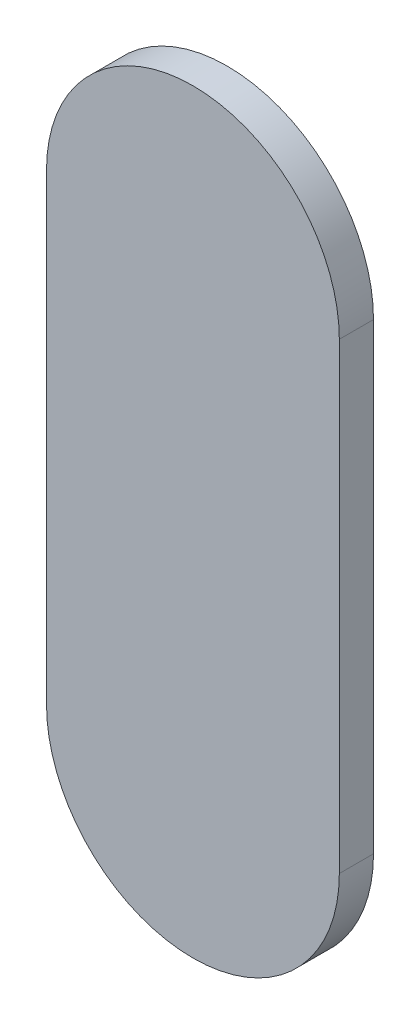
ISO-10303-21;
HEADER;
FILE_DESCRIPTION(('STEP AP214'),'2;1');
FILE_NAME('part.step','',(''),(''),'','','');
FILE_SCHEMA(('AUTOMOTIVE_DESIGN { 1 0 10303 214 1 1 1 1 }'));
ENDSEC;
DATA;
#1=APPLICATION_CONTEXT('core data for automotive mechanical design processes');
#2=APPLICATION_PROTOCOL_DEFINITION('international standard','automotive_design',2000,#1);
#3=PRODUCT_CONTEXT('',#1,'mechanical');
#4=PRODUCT('Part','Part','',(#3));
#5=PRODUCT_RELATED_PRODUCT_CATEGORY('part','',(#4));
#6=PRODUCT_DEFINITION_FORMATION('','',#4);
#7=PRODUCT_DEFINITION_CONTEXT('part definition',#1,'design');
#8=PRODUCT_DEFINITION('design','',#6,#7);
#9=PRODUCT_DEFINITION_SHAPE('','',#8);
#10=(LENGTH_UNIT() NAMED_UNIT(*) SI_UNIT(.MILLI.,.METRE.));
#11=(NAMED_UNIT(*) PLANE_ANGLE_UNIT() SI_UNIT($,.RADIAN.));
#12=(NAMED_UNIT(*) SI_UNIT($,.STERADIAN.) SOLID_ANGLE_UNIT());
#13=UNCERTAINTY_MEASURE_WITH_UNIT(LENGTH_MEASURE(1.E-05),#10,'distance_accuracy_value','');
#14=(GEOMETRIC_REPRESENTATION_CONTEXT(3) GLOBAL_UNCERTAINTY_ASSIGNED_CONTEXT((#13)) GLOBAL_UNIT_ASSIGNED_CONTEXT((#10,
#11,#12)) REPRESENTATION_CONTEXT('',''));
#15=CARTESIAN_POINT('',(0.,0.,0.));
#16=DIRECTION('',(0.,0.,1.));
#17=DIRECTION('',(1.,0.,0.));
#18=AXIS2_PLACEMENT_3D('',#15,#16,#17);
#19=CARTESIAN_POINT('',(135.05,-118.236,1.635));
#20=DIRECTION('',(0.,0.,1.));
#21=DIRECTION('',(1.,0.,0.));
#22=AXIS2_PLACEMENT_3D('',#19,#20,#21);
#23=PLANE('',#22);
#24=DIRECTION('',(0.,-1.,0.));
#25=VECTOR('',#24,1.);
#26=CARTESIAN_POINT('',(135.05,-118.236,1.635));
#27=LINE('',#26,#25);
#28=CARTESIAN_POINT('',(135.05,-118.236,1.635));
#29=VERTEX_POINT('',#28);
#30=CARTESIAN_POINT('',(135.05,-118.71,1.635));
#31=VERTEX_POINT('',#30);
#32=EDGE_CURVE('E83',#29,#31,#27,.T.);
#33=ORIENTED_EDGE('',*,*,#32,.T.);
#34=CARTESIAN_POINT('',(135.2,-118.71,1.635));
#35=DIRECTION('',(0.,0.,1.));
#36=DIRECTION('',(-1.,0.,0.));
#37=AXIS2_PLACEMENT_3D('',#34,#35,#36);
#38=CIRCLE('',#37,0.15);
#39=CARTESIAN_POINT('',(135.35,-118.71,1.635));
#40=VERTEX_POINT('',#39);
#41=EDGE_CURVE('E109',#31,#40,#38,.T.);
#42=ORIENTED_EDGE('',*,*,#41,.T.);
#43=DIRECTION('',(0.,1.,0.));
#44=VECTOR('',#43,1.);
#45=CARTESIAN_POINT('',(135.35,-118.71,1.635));
#46=LINE('',#45,#44);
#47=CARTESIAN_POINT('',(135.35,-118.236,1.635));
#48=VERTEX_POINT('',#47);
#49=EDGE_CURVE('E20',#40,#48,#46,.T.);
#50=ORIENTED_EDGE('',*,*,#49,.T.);
#51=CARTESIAN_POINT('',(135.2,-118.236,1.635));
#52=DIRECTION('',(0.,0.,1.));
#53=DIRECTION('',(1.,0.,0.));
#54=AXIS2_PLACEMENT_3D('',#51,#52,#53);
#55=CIRCLE('',#54,0.15);
#56=EDGE_CURVE('E11',#48,#29,#55,.T.);
#57=ORIENTED_EDGE('',*,*,#56,.T.);
#58=EDGE_LOOP('',(#33,#42,#50,#57));
#59=FACE_BOUND('',#58,.T.);
#60=ADVANCED_FACE('F17',(#59),#23,.T.);
#61=CARTESIAN_POINT('',(135.05,-118.236,1.6));
#62=DIRECTION('',(0.,0.,1.));
#63=DIRECTION('',(1.,0.,0.));
#64=AXIS2_PLACEMENT_3D('',#61,#62,#63);
#65=PLANE('',#64);
#66=CARTESIAN_POINT('',(135.2,-118.236,1.6));
#67=DIRECTION('',(0.,0.,1.));
#68=DIRECTION('',(1.,0.,0.));
#69=AXIS2_PLACEMENT_3D('',#66,#67,#68);
#70=CIRCLE('',#69,0.15);
#71=CARTESIAN_POINT('',(135.35,-118.236,1.6));
#72=VERTEX_POINT('',#71);
#73=CARTESIAN_POINT('',(135.05,-118.236,1.6));
#74=VERTEX_POINT('',#73);
#75=EDGE_CURVE('E26',#72,#74,#70,.T.);
#76=ORIENTED_EDGE('',*,*,#75,.F.);
#77=DIRECTION('',(0.,1.,0.));
#78=VECTOR('',#77,1.);
#79=CARTESIAN_POINT('',(135.35,-118.71,1.6));
#80=LINE('',#79,#78);
#81=CARTESIAN_POINT('',(135.35,-118.71,1.6));
#82=VERTEX_POINT('',#81);
#83=EDGE_CURVE('E100',#82,#72,#80,.T.);
#84=ORIENTED_EDGE('',*,*,#83,.F.);
#85=CARTESIAN_POINT('',(135.2,-118.71,1.6));
#86=DIRECTION('',(0.,0.,1.));
#87=DIRECTION('',(-1.,0.,0.));
#88=AXIS2_PLACEMENT_3D('',#85,#86,#87);
#89=CIRCLE('',#88,0.15);
#90=CARTESIAN_POINT('',(135.05,-118.71,1.6));
#91=VERTEX_POINT('',#90);
#92=EDGE_CURVE('E85',#91,#82,#89,.T.);
#93=ORIENTED_EDGE('',*,*,#92,.F.);
#94=DIRECTION('',(0.,-1.,0.));
#95=VECTOR('',#94,1.);
#96=CARTESIAN_POINT('',(135.05,-118.236,1.6));
#97=LINE('',#96,#95);
#98=EDGE_CURVE('E81',#74,#91,#97,.T.);
#99=ORIENTED_EDGE('',*,*,#98,.F.);
#100=EDGE_LOOP('',(#76,#84,#93,#99));
#101=FACE_BOUND('',#100,.T.);
#102=ADVANCED_FACE('F87',(#101),#65,.F.);
#103=CARTESIAN_POINT('',(135.2,-118.236,1.6));
#104=DIRECTION('',(0.,0.,-1.));
#105=DIRECTION('',(1.,0.,0.));
#106=AXIS2_PLACEMENT_3D('',#103,#104,#105);
#107=CYLINDRICAL_SURFACE('',#106,0.15);
#108=ORIENTED_EDGE('',*,*,#75,.T.);
#109=DIRECTION('',(0.,0.,1.));
#110=VECTOR('',#109,1.);
#111=CARTESIAN_POINT('',(135.05,-118.236,1.6));
#112=LINE('',#111,#110);
#113=EDGE_CURVE('E70',#74,#29,#112,.T.);
#114=ORIENTED_EDGE('',*,*,#113,.T.);
#115=ORIENTED_EDGE('',*,*,#56,.F.);
#116=DIRECTION('',(0.,0.,1.));
#117=VECTOR('',#116,1.);
#118=CARTESIAN_POINT('',(135.35,-118.236,1.6));
#119=LINE('',#118,#117);
#120=EDGE_CURVE('E73',#72,#48,#119,.T.);
#121=ORIENTED_EDGE('',*,*,#120,.F.);
#122=EDGE_LOOP('',(#108,#114,#115,#121));
#123=FACE_BOUND('',#122,.T.);
#124=ADVANCED_FACE('F69',(#123),#107,.T.);
#125=CARTESIAN_POINT('',(135.35,-118.71,1.6));
#126=DIRECTION('',(-1.,0.,0.));
#127=DIRECTION('',(0.,0.,1.));
#128=AXIS2_PLACEMENT_3D('',#125,#126,#127);
#129=PLANE('',#128);
#130=ORIENTED_EDGE('',*,*,#83,.T.);
#131=ORIENTED_EDGE('',*,*,#120,.T.);
#132=ORIENTED_EDGE('',*,*,#49,.F.);
#133=DIRECTION('',(0.,0.,1.));
#134=VECTOR('',#133,1.);
#135=CARTESIAN_POINT('',(135.35,-118.71,1.6));
#136=LINE('',#135,#134);
#137=EDGE_CURVE('E105',#82,#40,#136,.T.);
#138=ORIENTED_EDGE('',*,*,#137,.F.);
#139=EDGE_LOOP('',(#130,#131,#132,#138));
#140=FACE_BOUND('',#139,.T.);
#141=ADVANCED_FACE('F121',(#140),#129,.F.);
#142=CARTESIAN_POINT('',(135.2,-118.71,1.6));
#143=DIRECTION('',(0.,0.,-1.));
#144=DIRECTION('',(-1.,0.,0.));
#145=AXIS2_PLACEMENT_3D('',#142,#143,#144);
#146=CYLINDRICAL_SURFACE('',#145,0.15);
#147=ORIENTED_EDGE('',*,*,#92,.T.);
#148=ORIENTED_EDGE('',*,*,#137,.T.);
#149=ORIENTED_EDGE('',*,*,#41,.F.);
#150=DIRECTION('',(0.,0.,1.));
#151=VECTOR('',#150,1.);
#152=CARTESIAN_POINT('',(135.05,-118.71,1.6));
#153=LINE('',#152,#151);
#154=EDGE_CURVE('E91',#91,#31,#153,.T.);
#155=ORIENTED_EDGE('',*,*,#154,.F.);
#156=EDGE_LOOP('',(#147,#148,#149,#155));
#157=FACE_BOUND('',#156,.T.);
#158=ADVANCED_FACE('F123',(#157),#146,.T.);
#159=CARTESIAN_POINT('',(135.05,-118.236,1.6));
#160=DIRECTION('',(1.,0.,0.));
#161=DIRECTION('',(0.,1.,0.));
#162=AXIS2_PLACEMENT_3D('',#159,#160,#161);
#163=PLANE('',#162);
#164=ORIENTED_EDGE('',*,*,#98,.T.);
#165=ORIENTED_EDGE('',*,*,#154,.T.);
#166=ORIENTED_EDGE('',*,*,#32,.F.);
#167=ORIENTED_EDGE('',*,*,#113,.F.);
#168=EDGE_LOOP('',(#164,#165,#166,#167));
#169=FACE_BOUND('',#168,.T.);
#170=ADVANCED_FACE('F79',(#169),#163,.F.);
#171=CLOSED_SHELL('',(#60,#102,#124,#141,#158,#170));
#172=MANIFOLD_SOLID_BREP('B1',#171);
#173=ADVANCED_BREP_SHAPE_REPRESENTATION('',(#18,#172),#14);
#174=SHAPE_DEFINITION_REPRESENTATION(#9,#173);
ENDSEC;
END-ISO-10303-21;
